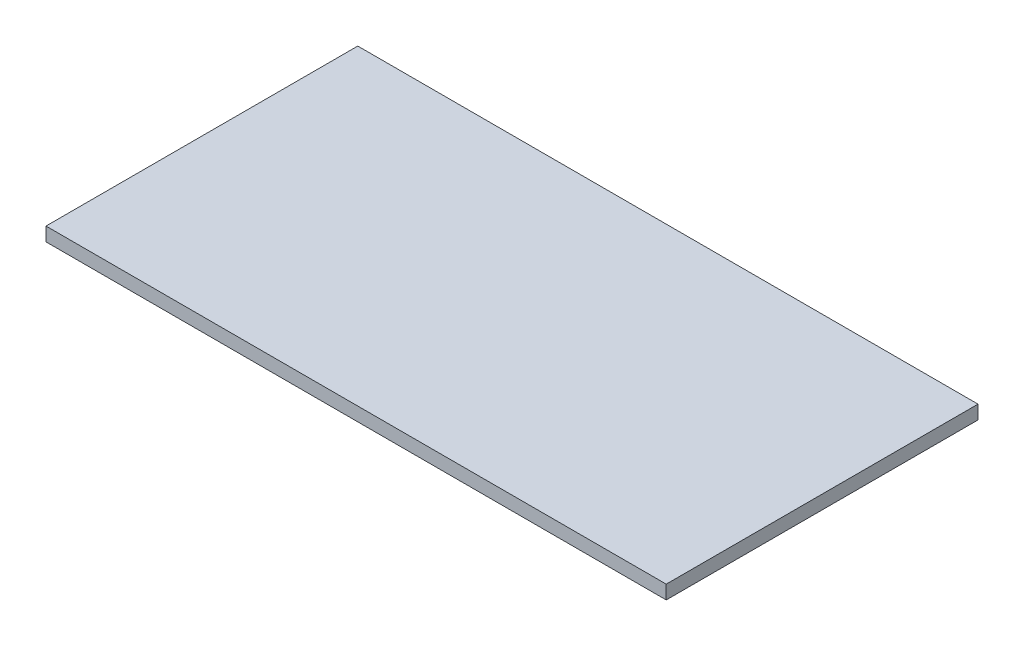
ISO-10303-21;
HEADER;
FILE_DESCRIPTION(('STEP AP214'),'2;1');
FILE_NAME('part.step','',(''),(''),'','','');
FILE_SCHEMA(('AUTOMOTIVE_DESIGN { 1 0 10303 214 1 1 1 1 }'));
ENDSEC;
DATA;
#1=APPLICATION_CONTEXT('core data for automotive mechanical design processes');
#2=APPLICATION_PROTOCOL_DEFINITION('international standard','automotive_design',2000,#1);
#3=PRODUCT_CONTEXT('',#1,'mechanical');
#4=PRODUCT('Part','Part','',(#3));
#5=PRODUCT_RELATED_PRODUCT_CATEGORY('part','',(#4));
#6=PRODUCT_DEFINITION_FORMATION('','',#4);
#7=PRODUCT_DEFINITION_CONTEXT('part definition',#1,'design');
#8=PRODUCT_DEFINITION('design','',#6,#7);
#9=PRODUCT_DEFINITION_SHAPE('','',#8);
#10=(LENGTH_UNIT() NAMED_UNIT(*) SI_UNIT(.MILLI.,.METRE.));
#11=(NAMED_UNIT(*) PLANE_ANGLE_UNIT() SI_UNIT($,.RADIAN.));
#12=(NAMED_UNIT(*) SI_UNIT($,.STERADIAN.) SOLID_ANGLE_UNIT());
#13=UNCERTAINTY_MEASURE_WITH_UNIT(LENGTH_MEASURE(1.E-05),#10,'distance_accuracy_value','');
#14=(GEOMETRIC_REPRESENTATION_CONTEXT(3) GLOBAL_UNCERTAINTY_ASSIGNED_CONTEXT((#13)) GLOBAL_UNIT_ASSIGNED_CONTEXT((#10,
#11,#12)) REPRESENTATION_CONTEXT('',''));
#15=CARTESIAN_POINT('',(0.,0.,0.));
#16=DIRECTION('',(0.,0.,1.));
#17=DIRECTION('',(1.,0.,0.));
#18=AXIS2_PLACEMENT_3D('',#15,#16,#17);
#19=CARTESIAN_POINT('',(0.,33.,0.));
#20=DIRECTION('',(1.,0.,0.));
#21=DIRECTION('',(0.,0.,-1.));
#22=AXIS2_PLACEMENT_3D('',#19,#20,#21);
#23=PLANE('',#22);
#24=DIRECTION('',(0.,0.,1.));
#25=VECTOR('',#24,1.);
#26=CARTESIAN_POINT('',(0.,0.,0.));
#27=LINE('',#26,#25);
#28=CARTESIAN_POINT('',(0.,0.,-750.));
#29=VERTEX_POINT('',#28);
#30=CARTESIAN_POINT('',(0.,0.,0.));
#31=VERTEX_POINT('',#30);
#32=EDGE_CURVE('E96',#29,#31,#27,.T.);
#33=ORIENTED_EDGE('',*,*,#32,.T.);
#34=DIRECTION('',(0.,-1.,0.));
#35=VECTOR('',#34,1.);
#36=CARTESIAN_POINT('',(0.,33.,0.));
#37=LINE('',#36,#35);
#38=CARTESIAN_POINT('',(0.,33.,0.));
#39=VERTEX_POINT('',#38);
#40=EDGE_CURVE('E11',#39,#31,#37,.T.);
#41=ORIENTED_EDGE('',*,*,#40,.F.);
#42=DIRECTION('',(0.,0.,1.));
#43=VECTOR('',#42,1.);
#44=CARTESIAN_POINT('',(0.,33.,0.));
#45=LINE('',#44,#43);
#46=CARTESIAN_POINT('',(0.,33.,-750.));
#47=VERTEX_POINT('',#46);
#48=EDGE_CURVE('E84',#47,#39,#45,.T.);
#49=ORIENTED_EDGE('',*,*,#48,.F.);
#50=DIRECTION('',(0.,-1.,0.));
#51=VECTOR('',#50,1.);
#52=CARTESIAN_POINT('',(0.,33.,-750.));
#53=LINE('',#52,#51);
#54=EDGE_CURVE('E92',#47,#29,#53,.T.);
#55=ORIENTED_EDGE('',*,*,#54,.T.);
#56=EDGE_LOOP('',(#33,#41,#49,#55));
#57=FACE_BOUND('',#56,.T.);
#58=ADVANCED_FACE('F33',(#57),#23,.F.);
#59=CARTESIAN_POINT('',(0.,33.,0.));
#60=DIRECTION('',(0.,0.,-1.));
#61=DIRECTION('',(-1.,0.,0.));
#62=AXIS2_PLACEMENT_3D('',#59,#60,#61);
#63=PLANE('',#62);
#64=DIRECTION('',(1.,0.,0.));
#65=VECTOR('',#64,1.);
#66=CARTESIAN_POINT('',(0.,0.,0.));
#67=LINE('',#66,#65);
#68=CARTESIAN_POINT('',(1492.,0.,0.));
#69=VERTEX_POINT('',#68);
#70=EDGE_CURVE('E88',#31,#69,#67,.T.);
#71=ORIENTED_EDGE('',*,*,#70,.T.);
#72=DIRECTION('',(0.,-1.,0.));
#73=VECTOR('',#72,1.);
#74=CARTESIAN_POINT('',(1492.,33.,0.));
#75=LINE('',#74,#73);
#76=CARTESIAN_POINT('',(1492.,33.,0.));
#77=VERTEX_POINT('',#76);
#78=EDGE_CURVE('E41',#77,#69,#75,.T.);
#79=ORIENTED_EDGE('',*,*,#78,.F.);
#80=DIRECTION('',(1.,0.,0.));
#81=VECTOR('',#80,1.);
#82=CARTESIAN_POINT('',(0.,33.,0.));
#83=LINE('',#82,#81);
#84=EDGE_CURVE('E79',#39,#77,#83,.T.);
#85=ORIENTED_EDGE('',*,*,#84,.F.);
#86=ORIENTED_EDGE('',*,*,#40,.T.);
#87=EDGE_LOOP('',(#71,#79,#85,#86));
#88=FACE_BOUND('',#87,.T.);
#89=ADVANCED_FACE('F87',(#88),#63,.F.);
#90=CARTESIAN_POINT('',(1492.,33.,0.));
#91=DIRECTION('',(-1.,0.,0.));
#92=DIRECTION('',(0.,0.,1.));
#93=AXIS2_PLACEMENT_3D('',#90,#91,#92);
#94=PLANE('',#93);
#95=DIRECTION('',(0.,0.,-1.));
#96=VECTOR('',#95,1.);
#97=CARTESIAN_POINT('',(1492.,0.,0.));
#98=LINE('',#97,#96);
#99=CARTESIAN_POINT('',(1492.,0.,-750.));
#100=VERTEX_POINT('',#99);
#101=EDGE_CURVE('E66',#69,#100,#98,.T.);
#102=ORIENTED_EDGE('',*,*,#101,.T.);
#103=DIRECTION('',(0.,-1.,0.));
#104=VECTOR('',#103,1.);
#105=CARTESIAN_POINT('',(1492.,33.,-750.));
#106=LINE('',#105,#104);
#107=CARTESIAN_POINT('',(1492.,33.,-750.));
#108=VERTEX_POINT('',#107);
#109=EDGE_CURVE('E89',#108,#100,#106,.T.);
#110=ORIENTED_EDGE('',*,*,#109,.F.);
#111=DIRECTION('',(0.,0.,-1.));
#112=VECTOR('',#111,1.);
#113=CARTESIAN_POINT('',(1492.,33.,0.));
#114=LINE('',#113,#112);
#115=EDGE_CURVE('E82',#77,#108,#114,.T.);
#116=ORIENTED_EDGE('',*,*,#115,.F.);
#117=ORIENTED_EDGE('',*,*,#78,.T.);
#118=EDGE_LOOP('',(#102,#110,#116,#117));
#119=FACE_BOUND('',#118,.T.);
#120=ADVANCED_FACE('F90',(#119),#94,.F.);
#121=CARTESIAN_POINT('',(0.,33.,-750.));
#122=DIRECTION('',(0.,0.,1.));
#123=DIRECTION('',(1.,0.,0.));
#124=AXIS2_PLACEMENT_3D('',#121,#122,#123);
#125=PLANE('',#124);
#126=DIRECTION('',(-1.,0.,0.));
#127=VECTOR('',#126,1.);
#128=CARTESIAN_POINT('',(0.,0.,-750.));
#129=LINE('',#128,#127);
#130=EDGE_CURVE('E72',#100,#29,#129,.T.);
#131=ORIENTED_EDGE('',*,*,#130,.T.);
#132=ORIENTED_EDGE('',*,*,#54,.F.);
#133=DIRECTION('',(-1.,0.,0.));
#134=VECTOR('',#133,1.);
#135=CARTESIAN_POINT('',(0.,33.,-750.));
#136=LINE('',#135,#134);
#137=EDGE_CURVE('E49',#108,#47,#136,.T.);
#138=ORIENTED_EDGE('',*,*,#137,.F.);
#139=ORIENTED_EDGE('',*,*,#109,.T.);
#140=EDGE_LOOP('',(#131,#132,#138,#139));
#141=FACE_BOUND('',#140,.T.);
#142=ADVANCED_FACE('F103',(#141),#125,.F.);
#143=CARTESIAN_POINT('',(0.,33.,0.));
#144=DIRECTION('',(0.,-1.,0.));
#145=DIRECTION('',(0.,0.,-1.));
#146=AXIS2_PLACEMENT_3D('',#143,#144,#145);
#147=PLANE('',#146);
#148=ORIENTED_EDGE('',*,*,#48,.T.);
#149=ORIENTED_EDGE('',*,*,#84,.T.);
#150=ORIENTED_EDGE('',*,*,#115,.T.);
#151=ORIENTED_EDGE('',*,*,#137,.T.);
#152=EDGE_LOOP('',(#148,#149,#150,#151));
#153=FACE_BOUND('',#152,.T.);
#154=ADVANCED_FACE('F80',(#153),#147,.F.);
#155=CARTESIAN_POINT('',(0.,0.,0.));
#156=DIRECTION('',(0.,-1.,0.));
#157=DIRECTION('',(0.,0.,-1.));
#158=AXIS2_PLACEMENT_3D('',#155,#156,#157);
#159=PLANE('',#158);
#160=ORIENTED_EDGE('',*,*,#32,.F.);
#161=ORIENTED_EDGE('',*,*,#130,.F.);
#162=ORIENTED_EDGE('',*,*,#101,.F.);
#163=ORIENTED_EDGE('',*,*,#70,.F.);
#164=EDGE_LOOP('',(#160,#161,#162,#163));
#165=FACE_BOUND('',#164,.T.);
#166=ADVANCED_FACE('F106',(#165),#159,.T.);
#167=CLOSED_SHELL('',(#58,#89,#120,#142,#154,#166));
#168=MANIFOLD_SOLID_BREP('B2',#167);
#169=ADVANCED_BREP_SHAPE_REPRESENTATION('',(#18,#168),#14);
#170=SHAPE_DEFINITION_REPRESENTATION(#9,#169);
ENDSEC;
END-ISO-10303-21;
